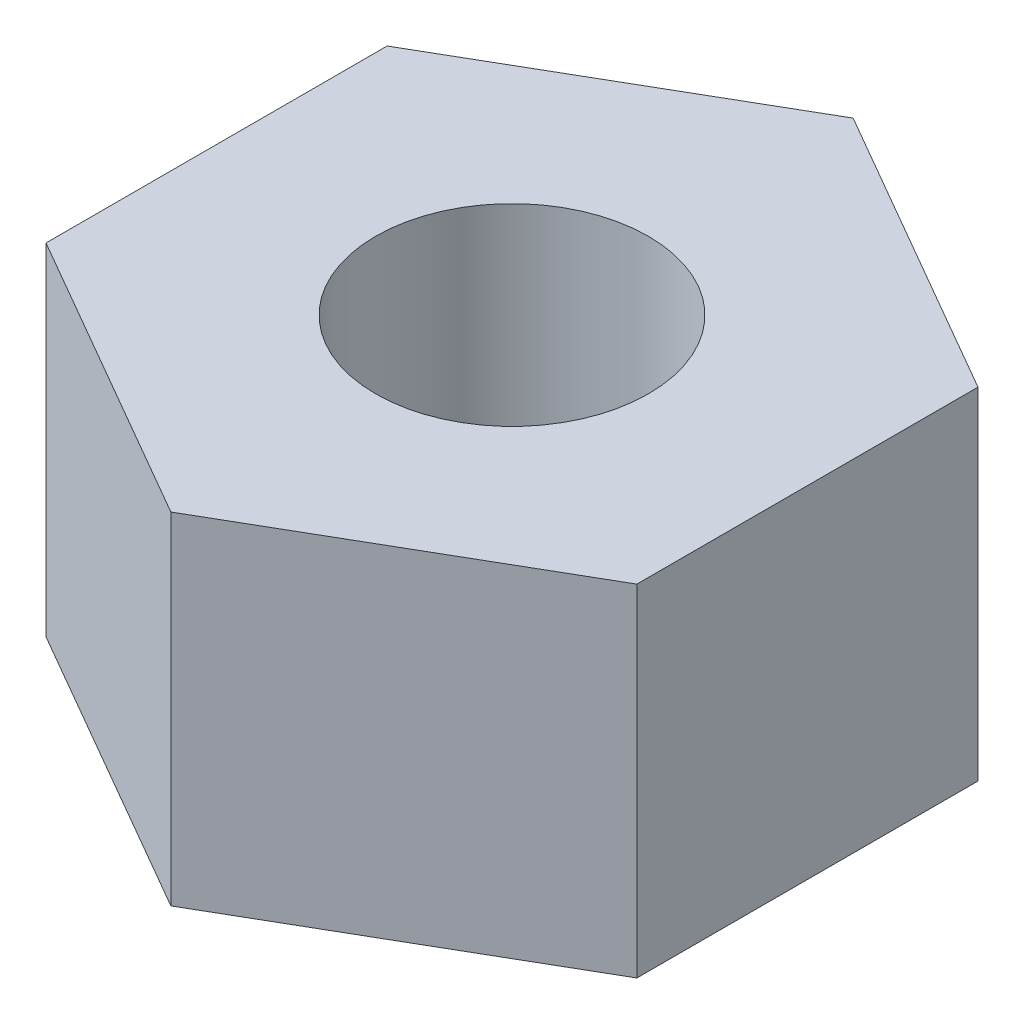
ISO-10303-21;
HEADER;
FILE_DESCRIPTION(('STEP AP214'),'2;1');
FILE_NAME('part.step','',(''),(''),'','','');
FILE_SCHEMA(('AUTOMOTIVE_DESIGN { 1 0 10303 214 1 1 1 1 }'));
ENDSEC;
DATA;
#1=APPLICATION_CONTEXT('core data for automotive mechanical design processes');
#2=APPLICATION_PROTOCOL_DEFINITION('international standard','automotive_design',2000,#1);
#3=PRODUCT_CONTEXT('',#1,'mechanical');
#4=PRODUCT('Part','Part','',(#3));
#5=PRODUCT_RELATED_PRODUCT_CATEGORY('part','',(#4));
#6=PRODUCT_DEFINITION_FORMATION('','',#4);
#7=PRODUCT_DEFINITION_CONTEXT('part definition',#1,'design');
#8=PRODUCT_DEFINITION('design','',#6,#7);
#9=PRODUCT_DEFINITION_SHAPE('','',#8);
#10=(LENGTH_UNIT() NAMED_UNIT(*) SI_UNIT(.MILLI.,.METRE.));
#11=(NAMED_UNIT(*) PLANE_ANGLE_UNIT() SI_UNIT($,.RADIAN.));
#12=(NAMED_UNIT(*) SI_UNIT($,.STERADIAN.) SOLID_ANGLE_UNIT());
#13=UNCERTAINTY_MEASURE_WITH_UNIT(LENGTH_MEASURE(1.E-05),#10,'distance_accuracy_value','');
#14=(GEOMETRIC_REPRESENTATION_CONTEXT(3) GLOBAL_UNCERTAINTY_ASSIGNED_CONTEXT((#13)) GLOBAL_UNIT_ASSIGNED_CONTEXT((#10,
#11,#12)) REPRESENTATION_CONTEXT('',''));
#15=CARTESIAN_POINT('',(0.,0.,0.));
#16=DIRECTION('',(0.,0.,1.));
#17=DIRECTION('',(1.,0.,0.));
#18=AXIS2_PLACEMENT_3D('',#15,#16,#17);
#19=CARTESIAN_POINT('',(0.,5.,0.));
#20=DIRECTION('',(0.,1.,0.));
#21=DIRECTION('',(0.,0.,1.));
#22=AXIS2_PLACEMENT_3D('',#19,#20,#21);
#23=PLANE('',#22);
#24=DIRECTION('',(0.866025403784439,0.,-0.5));
#25=VECTOR('',#24,1.);
#26=CARTESIAN_POINT('',(0.,5.,5.));
#27=LINE('',#26,#25);
#28=CARTESIAN_POINT('',(0.,5.,5.));
#29=VERTEX_POINT('',#28);
#30=CARTESIAN_POINT('',(4.33012701892219,5.,2.5));
#31=VERTEX_POINT('',#30);
#32=EDGE_CURVE('E137',#29,#31,#27,.T.);
#33=ORIENTED_EDGE('',*,*,#32,.T.);
#34=DIRECTION('',(0.,0.,-1.));
#35=VECTOR('',#34,1.);
#36=CARTESIAN_POINT('',(4.33012701892219,5.,2.5));
#37=LINE('',#36,#35);
#38=CARTESIAN_POINT('',(4.33012701892219,5.,-2.5));
#39=VERTEX_POINT('',#38);
#40=EDGE_CURVE('E95',#31,#39,#37,.T.);
#41=ORIENTED_EDGE('',*,*,#40,.T.);
#42=DIRECTION('',(-0.866025403784439,0.,-0.5));
#43=VECTOR('',#42,1.);
#44=CARTESIAN_POINT('',(4.33012701892219,5.,-2.5));
#45=LINE('',#44,#43);
#46=CARTESIAN_POINT('',(0.,5.,-5.));
#47=VERTEX_POINT('',#46);
#48=EDGE_CURVE('E108',#39,#47,#45,.T.);
#49=ORIENTED_EDGE('',*,*,#48,.T.);
#50=DIRECTION('',(-0.866025403784439,0.,0.5));
#51=VECTOR('',#50,1.);
#52=CARTESIAN_POINT('',(0.,5.,-5.));
#53=LINE('',#52,#51);
#54=CARTESIAN_POINT('',(-4.33012701892219,5.,-2.5));
#55=VERTEX_POINT('',#54);
#56=EDGE_CURVE('E102',#47,#55,#53,.T.);
#57=ORIENTED_EDGE('',*,*,#56,.T.);
#58=DIRECTION('',(0.,0.,1.));
#59=VECTOR('',#58,1.);
#60=CARTESIAN_POINT('',(-4.33012701892219,5.,-2.5));
#61=LINE('',#60,#59);
#62=CARTESIAN_POINT('',(-4.33012701892219,5.,2.5));
#63=VERTEX_POINT('',#62);
#64=EDGE_CURVE('E106',#55,#63,#61,.T.);
#65=ORIENTED_EDGE('',*,*,#64,.T.);
#66=DIRECTION('',(0.866025403784439,0.,0.5));
#67=VECTOR('',#66,1.);
#68=CARTESIAN_POINT('',(-4.33012701892219,5.,2.5));
#69=LINE('',#68,#67);
#70=EDGE_CURVE('E58',#63,#29,#69,.T.);
#71=ORIENTED_EDGE('',*,*,#70,.T.);
#72=EDGE_LOOP('',(#33,#41,#49,#57,#65,#71));
#73=FACE_BOUND('',#72,.T.);
#74=CARTESIAN_POINT('',(0.,5.,0.));
#75=DIRECTION('',(0.,1.,0.));
#76=DIRECTION('',(0.,0.,1.));
#77=AXIS2_PLACEMENT_3D('',#74,#75,#76);
#78=CIRCLE('',#77,2.);
#79=CARTESIAN_POINT('',(0.,5.,2.));
#80=VERTEX_POINT('',#79);
#81=EDGE_CURVE('E130',#80,#80,#78,.T.);
#82=ORIENTED_EDGE('',*,*,#81,.F.);
#83=EDGE_LOOP('',(#82));
#84=FACE_BOUND('',#83,.T.);
#85=ADVANCED_FACE('F41',(#73,#84),#23,.T.);
#86=CARTESIAN_POINT('',(0.,0.,0.));
#87=DIRECTION('',(0.,1.,0.));
#88=DIRECTION('',(0.,0.,1.));
#89=AXIS2_PLACEMENT_3D('',#86,#87,#88);
#90=PLANE('',#89);
#91=DIRECTION('',(0.866025403784439,0.,-0.5));
#92=VECTOR('',#91,1.);
#93=CARTESIAN_POINT('',(0.,0.,5.));
#94=LINE('',#93,#92);
#95=CARTESIAN_POINT('',(0.,0.,5.));
#96=VERTEX_POINT('',#95);
#97=CARTESIAN_POINT('',(4.33012701892219,0.,2.5));
#98=VERTEX_POINT('',#97);
#99=EDGE_CURVE('E126',#96,#98,#94,.T.);
#100=ORIENTED_EDGE('',*,*,#99,.F.);
#101=DIRECTION('',(0.866025403784439,0.,0.5));
#102=VECTOR('',#101,1.);
#103=CARTESIAN_POINT('',(-4.33012701892219,0.,2.5));
#104=LINE('',#103,#102);
#105=CARTESIAN_POINT('',(-4.33012701892219,0.,2.5));
#106=VERTEX_POINT('',#105);
#107=EDGE_CURVE('E87',#106,#96,#104,.T.);
#108=ORIENTED_EDGE('',*,*,#107,.F.);
#109=DIRECTION('',(0.,0.,1.));
#110=VECTOR('',#109,1.);
#111=CARTESIAN_POINT('',(-4.33012701892219,0.,-2.5));
#112=LINE('',#111,#110);
#113=CARTESIAN_POINT('',(-4.33012701892219,0.,-2.5));
#114=VERTEX_POINT('',#113);
#115=EDGE_CURVE('E81',#114,#106,#112,.T.);
#116=ORIENTED_EDGE('',*,*,#115,.F.);
#117=DIRECTION('',(-0.866025403784439,0.,0.5));
#118=VECTOR('',#117,1.);
#119=CARTESIAN_POINT('',(0.,0.,-5.));
#120=LINE('',#119,#118);
#121=CARTESIAN_POINT('',(0.,0.,-5.));
#122=VERTEX_POINT('',#121);
#123=EDGE_CURVE('E116',#122,#114,#120,.T.);
#124=ORIENTED_EDGE('',*,*,#123,.F.);
#125=DIRECTION('',(-0.866025403784439,0.,-0.5));
#126=VECTOR('',#125,1.);
#127=CARTESIAN_POINT('',(4.33012701892219,0.,-2.5));
#128=LINE('',#127,#126);
#129=CARTESIAN_POINT('',(4.33012701892219,0.,-2.5));
#130=VERTEX_POINT('',#129);
#131=EDGE_CURVE('E132',#130,#122,#128,.T.);
#132=ORIENTED_EDGE('',*,*,#131,.F.);
#133=DIRECTION('',(0.,0.,-1.));
#134=VECTOR('',#133,1.);
#135=CARTESIAN_POINT('',(4.33012701892219,0.,2.5));
#136=LINE('',#135,#134);
#137=EDGE_CURVE('E129',#98,#130,#136,.T.);
#138=ORIENTED_EDGE('',*,*,#137,.F.);
#139=EDGE_LOOP('',(#100,#108,#116,#124,#132,#138));
#140=FACE_BOUND('',#139,.T.);
#141=CARTESIAN_POINT('',(0.,0.,0.));
#142=DIRECTION('',(0.,1.,0.));
#143=DIRECTION('',(0.,0.,1.));
#144=AXIS2_PLACEMENT_3D('',#141,#142,#143);
#145=CIRCLE('',#144,2.);
#146=CARTESIAN_POINT('',(0.,0.,2.));
#147=VERTEX_POINT('',#146);
#148=EDGE_CURVE('E248',#147,#147,#145,.T.);
#149=ORIENTED_EDGE('',*,*,#148,.T.);
#150=EDGE_LOOP('',(#149));
#151=FACE_BOUND('',#150,.T.);
#152=ADVANCED_FACE('F146',(#140,#151),#90,.F.);
#153=CARTESIAN_POINT('',(0.,5.,5.));
#154=DIRECTION('',(-0.5,0.,-0.866025403784439));
#155=DIRECTION('',(-0.866025403784439,0.,0.5));
#156=AXIS2_PLACEMENT_3D('',#153,#154,#155);
#157=PLANE('',#156);
#158=ORIENTED_EDGE('',*,*,#99,.T.);
#159=DIRECTION('',(0.,-1.,0.));
#160=VECTOR('',#159,1.);
#161=CARTESIAN_POINT('',(4.33012701892219,5.,2.5));
#162=LINE('',#161,#160);
#163=EDGE_CURVE('E11',#31,#98,#162,.T.);
#164=ORIENTED_EDGE('',*,*,#163,.F.);
#165=ORIENTED_EDGE('',*,*,#32,.F.);
#166=DIRECTION('',(0.,-1.,0.));
#167=VECTOR('',#166,1.);
#168=CARTESIAN_POINT('',(0.,5.,5.));
#169=LINE('',#168,#167);
#170=EDGE_CURVE('E122',#29,#96,#169,.T.);
#171=ORIENTED_EDGE('',*,*,#170,.T.);
#172=EDGE_LOOP('',(#158,#164,#165,#171));
#173=FACE_BOUND('',#172,.T.);
#174=ADVANCED_FACE('F43',(#173),#157,.F.);
#175=CARTESIAN_POINT('',(4.33012701892219,5.,2.5));
#176=DIRECTION('',(-1.,0.,0.));
#177=DIRECTION('',(0.,0.,1.));
#178=AXIS2_PLACEMENT_3D('',#175,#176,#177);
#179=PLANE('',#178);
#180=ORIENTED_EDGE('',*,*,#137,.T.);
#181=DIRECTION('',(0.,-1.,0.));
#182=VECTOR('',#181,1.);
#183=CARTESIAN_POINT('',(4.33012701892219,5.,-2.5));
#184=LINE('',#183,#182);
#185=EDGE_CURVE('E50',#39,#130,#184,.T.);
#186=ORIENTED_EDGE('',*,*,#185,.F.);
#187=ORIENTED_EDGE('',*,*,#40,.F.);
#188=ORIENTED_EDGE('',*,*,#163,.T.);
#189=EDGE_LOOP('',(#180,#186,#187,#188));
#190=FACE_BOUND('',#189,.T.);
#191=ADVANCED_FACE('F171',(#190),#179,.F.);
#192=CARTESIAN_POINT('',(4.33012701892219,5.,-2.5));
#193=DIRECTION('',(-0.5,0.,0.866025403784439));
#194=DIRECTION('',(0.866025403784439,0.,0.5));
#195=AXIS2_PLACEMENT_3D('',#192,#193,#194);
#196=PLANE('',#195);
#197=ORIENTED_EDGE('',*,*,#131,.T.);
#198=DIRECTION('',(0.,-1.,0.));
#199=VECTOR('',#198,1.);
#200=CARTESIAN_POINT('',(0.,5.,-5.));
#201=LINE('',#200,#199);
#202=EDGE_CURVE('E117',#47,#122,#201,.T.);
#203=ORIENTED_EDGE('',*,*,#202,.F.);
#204=ORIENTED_EDGE('',*,*,#48,.F.);
#205=ORIENTED_EDGE('',*,*,#185,.T.);
#206=EDGE_LOOP('',(#197,#203,#204,#205));
#207=FACE_BOUND('',#206,.T.);
#208=ADVANCED_FACE('F143',(#207),#196,.F.);
#209=CARTESIAN_POINT('',(0.,5.,-5.));
#210=DIRECTION('',(0.5,0.,0.866025403784439));
#211=DIRECTION('',(0.866025403784439,0.,-0.5));
#212=AXIS2_PLACEMENT_3D('',#209,#210,#211);
#213=PLANE('',#212);
#214=ORIENTED_EDGE('',*,*,#123,.T.);
#215=DIRECTION('',(0.,-1.,0.));
#216=VECTOR('',#215,1.);
#217=CARTESIAN_POINT('',(-4.33012701892219,5.,-2.5));
#218=LINE('',#217,#216);
#219=EDGE_CURVE('E113',#55,#114,#218,.T.);
#220=ORIENTED_EDGE('',*,*,#219,.F.);
#221=ORIENTED_EDGE('',*,*,#56,.F.);
#222=ORIENTED_EDGE('',*,*,#202,.T.);
#223=EDGE_LOOP('',(#214,#220,#221,#222));
#224=FACE_BOUND('',#223,.T.);
#225=ADVANCED_FACE('F114',(#224),#213,.F.);
#226=CARTESIAN_POINT('',(-4.33012701892219,5.,-2.5));
#227=DIRECTION('',(1.,0.,0.));
#228=DIRECTION('',(0.,0.,-1.));
#229=AXIS2_PLACEMENT_3D('',#226,#227,#228);
#230=PLANE('',#229);
#231=ORIENTED_EDGE('',*,*,#115,.T.);
#232=DIRECTION('',(0.,-1.,0.));
#233=VECTOR('',#232,1.);
#234=CARTESIAN_POINT('',(-4.33012701892219,5.,2.5));
#235=LINE('',#234,#233);
#236=EDGE_CURVE('E118',#63,#106,#235,.T.);
#237=ORIENTED_EDGE('',*,*,#236,.F.);
#238=ORIENTED_EDGE('',*,*,#64,.F.);
#239=ORIENTED_EDGE('',*,*,#219,.T.);
#240=EDGE_LOOP('',(#231,#237,#238,#239));
#241=FACE_BOUND('',#240,.T.);
#242=ADVANCED_FACE('F120',(#241),#230,.F.);
#243=CARTESIAN_POINT('',(-4.33012701892219,5.,2.5));
#244=DIRECTION('',(0.5,0.,-0.866025403784438));
#245=DIRECTION('',(-0.866025403784439,0.,-0.5));
#246=AXIS2_PLACEMENT_3D('',#243,#244,#245);
#247=PLANE('',#246);
#248=ORIENTED_EDGE('',*,*,#107,.T.);
#249=ORIENTED_EDGE('',*,*,#170,.F.);
#250=ORIENTED_EDGE('',*,*,#70,.F.);
#251=ORIENTED_EDGE('',*,*,#236,.T.);
#252=EDGE_LOOP('',(#248,#249,#250,#251));
#253=FACE_BOUND('',#252,.T.);
#254=ADVANCED_FACE('F151',(#253),#247,.F.);
#255=CARTESIAN_POINT('',(0.,5.,0.));
#256=DIRECTION('',(0.,-1.,0.));
#257=DIRECTION('',(0.,0.,-1.));
#258=AXIS2_PLACEMENT_3D('',#255,#256,#257);
#259=CYLINDRICAL_SURFACE('',#258,2.);
#260=ORIENTED_EDGE('',*,*,#81,.T.);
#261=EDGE_LOOP('',(#260));
#262=FACE_BOUND('',#261,.T.);
#263=ORIENTED_EDGE('',*,*,#148,.F.);
#264=EDGE_LOOP('',(#263));
#265=FACE_BOUND('',#264,.T.);
#266=ADVANCED_FACE('F153',(#262,#265),#259,.F.);
#267=CLOSED_SHELL('',(#85,#152,#174,#191,#208,#225,#242,#254,#266));
#268=MANIFOLD_SOLID_BREP('B2',#267);
#269=ADVANCED_BREP_SHAPE_REPRESENTATION('',(#18,#268),#14);
#270=SHAPE_DEFINITION_REPRESENTATION(#9,#269);
ENDSEC;
END-ISO-10303-21;
